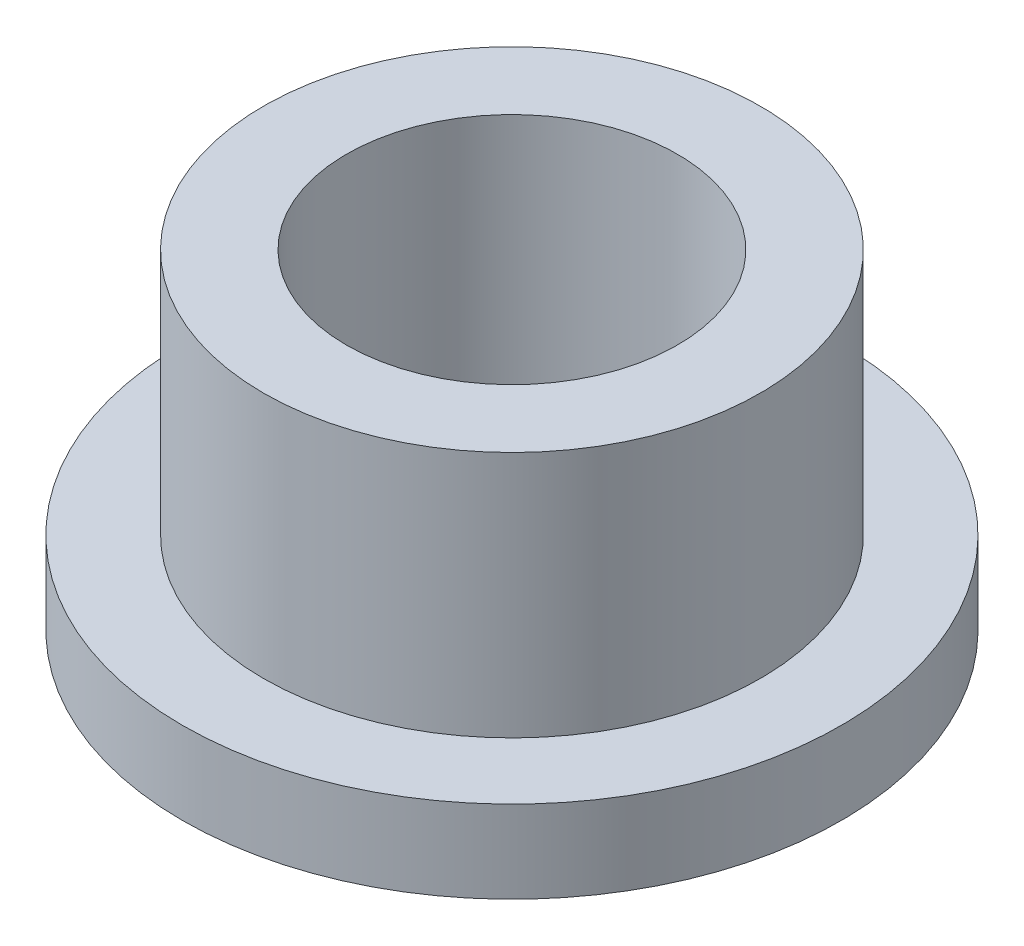
ISO-10303-21;
HEADER;
FILE_DESCRIPTION(('STEP AP214'),'2;1');
FILE_NAME('part.step','',(''),(''),'','','');
FILE_SCHEMA(('AUTOMOTIVE_DESIGN { 1 0 10303 214 1 1 1 1 }'));
ENDSEC;
DATA;
#1=APPLICATION_CONTEXT('core data for automotive mechanical design processes');
#2=APPLICATION_PROTOCOL_DEFINITION('international standard','automotive_design',2000,#1);
#3=PRODUCT_CONTEXT('',#1,'mechanical');
#4=PRODUCT('Part','Part','',(#3));
#5=PRODUCT_RELATED_PRODUCT_CATEGORY('part','',(#4));
#6=PRODUCT_DEFINITION_FORMATION('','',#4);
#7=PRODUCT_DEFINITION_CONTEXT('part definition',#1,'design');
#8=PRODUCT_DEFINITION('design','',#6,#7);
#9=PRODUCT_DEFINITION_SHAPE('','',#8);
#10=(LENGTH_UNIT() NAMED_UNIT(*) SI_UNIT(.MILLI.,.METRE.));
#11=(NAMED_UNIT(*) PLANE_ANGLE_UNIT() SI_UNIT($,.RADIAN.));
#12=(NAMED_UNIT(*) SI_UNIT($,.STERADIAN.) SOLID_ANGLE_UNIT());
#13=UNCERTAINTY_MEASURE_WITH_UNIT(LENGTH_MEASURE(1.E-05),#10,'distance_accuracy_value','');
#14=(GEOMETRIC_REPRESENTATION_CONTEXT(3) GLOBAL_UNCERTAINTY_ASSIGNED_CONTEXT((#13)) GLOBAL_UNIT_ASSIGNED_CONTEXT((#10,
#11,#12)) REPRESENTATION_CONTEXT('',''));
#15=CARTESIAN_POINT('',(0.,0.,0.));
#16=DIRECTION('',(0.,0.,1.));
#17=DIRECTION('',(1.,0.,0.));
#18=AXIS2_PLACEMENT_3D('',#15,#16,#17);
#19=CARTESIAN_POINT('',(0.,6.35,0.));
#20=DIRECTION('',(0.,1.,0.));
#21=DIRECTION('',(0.,0.,1.));
#22=AXIS2_PLACEMENT_3D('',#19,#20,#21);
#23=PLANE('',#22);
#24=CARTESIAN_POINT('',(0.,6.35,0.));
#25=DIRECTION('',(0.,1.,0.));
#26=DIRECTION('',(0.,0.,1.));
#27=AXIS2_PLACEMENT_3D('',#24,#25,#26);
#28=CIRCLE('',#27,4.7879);
#29=CARTESIAN_POINT('',(0.,6.35,4.7879));
#30=VERTEX_POINT('',#29);
#31=EDGE_CURVE('E10',#30,#30,#28,.T.);
#32=ORIENTED_EDGE('',*,*,#31,.T.);
#33=EDGE_LOOP('',(#32));
#34=FACE_BOUND('',#33,.T.);
#35=CARTESIAN_POINT('',(0.,6.35,0.));
#36=DIRECTION('',(0.,1.,0.));
#37=DIRECTION('',(0.,0.,1.));
#38=AXIS2_PLACEMENT_3D('',#35,#36,#37);
#39=CIRCLE('',#38,3.1877);
#40=CARTESIAN_POINT('',(0.,6.35,3.1877));
#41=VERTEX_POINT('',#40);
#42=EDGE_CURVE('E39',#41,#41,#39,.T.);
#43=ORIENTED_EDGE('',*,*,#42,.F.);
#44=EDGE_LOOP('',(#43));
#45=FACE_BOUND('',#44,.T.);
#46=ADVANCED_FACE('F32',(#34,#45),#23,.T.);
#47=CARTESIAN_POINT('',(0.,0.,0.));
#48=DIRECTION('',(0.,1.,0.));
#49=DIRECTION('',(0.,0.,1.));
#50=AXIS2_PLACEMENT_3D('',#47,#48,#49);
#51=PLANE('',#50);
#52=CARTESIAN_POINT('',(0.,0.,0.));
#53=DIRECTION('',(0.,1.,0.));
#54=DIRECTION('',(0.,0.,1.));
#55=AXIS2_PLACEMENT_3D('',#52,#53,#54);
#56=CIRCLE('',#55,3.1877);
#57=CARTESIAN_POINT('',(0.,0.,3.1877));
#58=VERTEX_POINT('',#57);
#59=EDGE_CURVE('E43',#58,#58,#56,.T.);
#60=ORIENTED_EDGE('',*,*,#59,.T.);
#61=EDGE_LOOP('',(#60));
#62=FACE_BOUND('',#61,.T.);
#63=CARTESIAN_POINT('',(0.,0.,0.));
#64=DIRECTION('',(0.,1.,0.));
#65=DIRECTION('',(0.,0.,1.));
#66=AXIS2_PLACEMENT_3D('',#63,#64,#65);
#67=CIRCLE('',#66,6.35);
#68=CARTESIAN_POINT('',(0.,0.,6.35));
#69=VERTEX_POINT('',#68);
#70=EDGE_CURVE('E50',#69,#69,#67,.T.);
#71=ORIENTED_EDGE('',*,*,#70,.F.);
#72=EDGE_LOOP('',(#71));
#73=FACE_BOUND('',#72,.T.);
#74=ADVANCED_FACE('F75',(#62,#73),#51,.F.);
#75=CARTESIAN_POINT('',(0.,6.35,0.));
#76=DIRECTION('',(0.,-1.,0.));
#77=DIRECTION('',(0.,0.,-1.));
#78=AXIS2_PLACEMENT_3D('',#75,#76,#77);
#79=CYLINDRICAL_SURFACE('',#78,4.7879);
#80=CARTESIAN_POINT('',(0.,1.5875,0.));
#81=DIRECTION('',(0.,1.,0.));
#82=DIRECTION('',(0.,0.,1.));
#83=AXIS2_PLACEMENT_3D('',#80,#81,#82);
#84=CIRCLE('',#83,4.7879);
#85=CARTESIAN_POINT('',(0.,1.5875,4.7879));
#86=VERTEX_POINT('',#85);
#87=EDGE_CURVE('E53',#86,#86,#84,.T.);
#88=ORIENTED_EDGE('',*,*,#87,.T.);
#89=EDGE_LOOP('',(#88));
#90=FACE_BOUND('',#89,.T.);
#91=ORIENTED_EDGE('',*,*,#31,.F.);
#92=EDGE_LOOP('',(#91));
#93=FACE_BOUND('',#92,.T.);
#94=ADVANCED_FACE('F34',(#90,#93),#79,.T.);
#95=CARTESIAN_POINT('',(0.,6.35,0.));
#96=DIRECTION('',(0.,-1.,0.));
#97=DIRECTION('',(0.,0.,-1.));
#98=AXIS2_PLACEMENT_3D('',#95,#96,#97);
#99=CYLINDRICAL_SURFACE('',#98,3.1877);
#100=ORIENTED_EDGE('',*,*,#42,.T.);
#101=EDGE_LOOP('',(#100));
#102=FACE_BOUND('',#101,.T.);
#103=ORIENTED_EDGE('',*,*,#59,.F.);
#104=EDGE_LOOP('',(#103));
#105=FACE_BOUND('',#104,.T.);
#106=ADVANCED_FACE('F64',(#102,#105),#99,.F.);
#107=CARTESIAN_POINT('',(0.,1.5875,0.));
#108=DIRECTION('',(0.,1.,0.));
#109=DIRECTION('',(0.,0.,1.));
#110=AXIS2_PLACEMENT_3D('',#107,#108,#109);
#111=PLANE('',#110);
#112=CARTESIAN_POINT('',(0.,1.5875,0.));
#113=DIRECTION('',(0.,1.,0.));
#114=DIRECTION('',(0.,0.,1.));
#115=AXIS2_PLACEMENT_3D('',#112,#113,#114);
#116=CIRCLE('',#115,6.35);
#117=CARTESIAN_POINT('',(0.,1.5875,6.35));
#118=VERTEX_POINT('',#117);
#119=EDGE_CURVE('E48',#118,#118,#116,.T.);
#120=ORIENTED_EDGE('',*,*,#119,.T.);
#121=EDGE_LOOP('',(#120));
#122=FACE_BOUND('',#121,.T.);
#123=ORIENTED_EDGE('',*,*,#87,.F.);
#124=EDGE_LOOP('',(#123));
#125=FACE_BOUND('',#124,.T.);
#126=ADVANCED_FACE('F61',(#122,#125),#111,.T.);
#127=CARTESIAN_POINT('',(0.,1.5875,0.));
#128=DIRECTION('',(0.,-1.,0.));
#129=DIRECTION('',(0.,0.,-1.));
#130=AXIS2_PLACEMENT_3D('',#127,#128,#129);
#131=CYLINDRICAL_SURFACE('',#130,6.35);
#132=ORIENTED_EDGE('',*,*,#119,.F.);
#133=EDGE_LOOP('',(#132));
#134=FACE_BOUND('',#133,.T.);
#135=ORIENTED_EDGE('',*,*,#70,.T.);
#136=EDGE_LOOP('',(#135));
#137=FACE_BOUND('',#136,.T.);
#138=ADVANCED_FACE('F63',(#134,#137),#131,.T.);
#139=CLOSED_SHELL('',(#46,#74,#94,#106,#126,#138));
#140=MANIFOLD_SOLID_BREP('B2',#139);
#141=ADVANCED_BREP_SHAPE_REPRESENTATION('',(#18,#140),#14);
#142=SHAPE_DEFINITION_REPRESENTATION(#9,#141);
ENDSEC;
END-ISO-10303-21;
